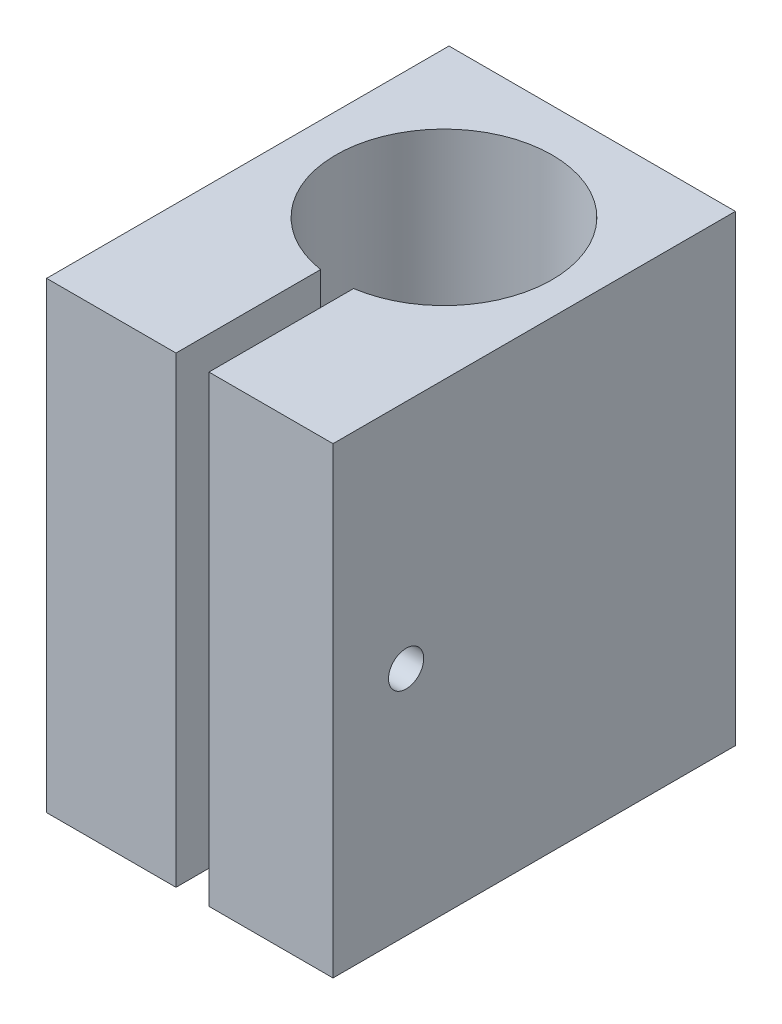
ISO-10303-21;
HEADER;
FILE_DESCRIPTION(('STEP AP214'),'2;1');
FILE_NAME('part.step','',(''),(''),'','','');
FILE_SCHEMA(('AUTOMOTIVE_DESIGN { 1 0 10303 214 1 1 1 1 }'));
ENDSEC;
DATA;
#1=APPLICATION_CONTEXT('core data for automotive mechanical design processes');
#2=APPLICATION_PROTOCOL_DEFINITION('international standard','automotive_design',2000,#1);
#3=PRODUCT_CONTEXT('',#1,'mechanical');
#4=PRODUCT('Part','Part','',(#3));
#5=PRODUCT_RELATED_PRODUCT_CATEGORY('part','',(#4));
#6=PRODUCT_DEFINITION_FORMATION('','',#4);
#7=PRODUCT_DEFINITION_CONTEXT('part definition',#1,'design');
#8=PRODUCT_DEFINITION('design','',#6,#7);
#9=PRODUCT_DEFINITION_SHAPE('','',#8);
#10=(LENGTH_UNIT() NAMED_UNIT(*) SI_UNIT(.MILLI.,.METRE.));
#11=(NAMED_UNIT(*) PLANE_ANGLE_UNIT() SI_UNIT($,.RADIAN.));
#12=(NAMED_UNIT(*) SI_UNIT($,.STERADIAN.) SOLID_ANGLE_UNIT());
#13=UNCERTAINTY_MEASURE_WITH_UNIT(LENGTH_MEASURE(1.E-05),#10,'distance_accuracy_value','');
#14=(GEOMETRIC_REPRESENTATION_CONTEXT(3) GLOBAL_UNCERTAINTY_ASSIGNED_CONTEXT((#13)) GLOBAL_UNIT_ASSIGNED_CONTEXT((#10,
#11,#12)) REPRESENTATION_CONTEXT('',''));
#15=CARTESIAN_POINT('',(0.,0.,0.));
#16=DIRECTION('',(0.,0.,1.));
#17=DIRECTION('',(1.,0.,0.));
#18=AXIS2_PLACEMENT_3D('',#15,#16,#17);
#19=CARTESIAN_POINT('',(1.90309523809524,46.,20.));
#20=DIRECTION('',(0.,0.,-1.));
#21=DIRECTION('',(-1.,0.,0.));
#22=AXIS2_PLACEMENT_3D('',#19,#20,#21);
#23=PLANE('',#22);
#24=DIRECTION('',(1.,0.,0.));
#25=VECTOR('',#24,1.);
#26=CARTESIAN_POINT('',(1.90309523809524,0.,20.));
#27=LINE('',#26,#25);
#28=CARTESIAN_POINT('',(1.90309523809524,0.,20.));
#29=VERTEX_POINT('',#28);
#30=CARTESIAN_POINT('',(14.235,0.,20.));
#31=VERTEX_POINT('',#30);
#32=EDGE_CURVE('E148',#29,#31,#27,.T.);
#33=ORIENTED_EDGE('',*,*,#32,.T.);
#34=DIRECTION('',(0.,-1.,0.));
#35=VECTOR('',#34,1.);
#36=CARTESIAN_POINT('',(14.235,46.,20.));
#37=LINE('',#36,#35);
#38=CARTESIAN_POINT('',(14.235,46.,20.));
#39=VERTEX_POINT('',#38);
#40=EDGE_CURVE('E11',#39,#31,#37,.T.);
#41=ORIENTED_EDGE('',*,*,#40,.F.);
#42=DIRECTION('',(1.,0.,0.));
#43=VECTOR('',#42,1.);
#44=CARTESIAN_POINT('',(1.90309523809524,46.,20.));
#45=LINE('',#44,#43);
#46=CARTESIAN_POINT('',(1.90309523809524,46.,20.));
#47=VERTEX_POINT('',#46);
#48=EDGE_CURVE('E164',#47,#39,#45,.T.);
#49=ORIENTED_EDGE('',*,*,#48,.F.);
#50=DIRECTION('',(0.,-1.,0.));
#51=VECTOR('',#50,1.);
#52=CARTESIAN_POINT('',(1.90309523809524,46.,20.));
#53=LINE('',#52,#51);
#54=EDGE_CURVE('E144',#47,#29,#53,.T.);
#55=ORIENTED_EDGE('',*,*,#54,.T.);
#56=EDGE_LOOP('',(#33,#41,#49,#55));
#57=FACE_BOUND('',#56,.T.);
#58=ADVANCED_FACE('F39',(#57),#23,.F.);
#59=CARTESIAN_POINT('',(14.235,46.,-20.));
#60=DIRECTION('',(-1.,0.,0.));
#61=DIRECTION('',(0.,0.,1.));
#62=AXIS2_PLACEMENT_3D('',#59,#60,#61);
#63=PLANE('',#62);
#64=CARTESIAN_POINT('',(14.235,23.,12.7330134340511));
#65=DIRECTION('',(-1.,0.,0.));
#66=DIRECTION('',(0.,0.,1.));
#67=AXIS2_PLACEMENT_3D('',#64,#65,#66);
#68=CIRCLE('',#67,1.75);
#69=CARTESIAN_POINT('',(14.235,23.,14.4830134340511));
#70=VERTEX_POINT('',#69);
#71=EDGE_CURVE('E253',#70,#70,#68,.T.);
#72=ORIENTED_EDGE('',*,*,#71,.T.);
#73=EDGE_LOOP('',(#72));
#74=FACE_BOUND('',#73,.T.);
#75=DIRECTION('',(0.,0.,-1.));
#76=VECTOR('',#75,1.);
#77=CARTESIAN_POINT('',(14.235,0.,-20.));
#78=LINE('',#77,#76);
#79=CARTESIAN_POINT('',(14.235,0.,-20.));
#80=VERTEX_POINT('',#79);
#81=EDGE_CURVE('E151',#31,#80,#78,.T.);
#82=ORIENTED_EDGE('',*,*,#81,.T.);
#83=DIRECTION('',(0.,-1.,0.));
#84=VECTOR('',#83,1.);
#85=CARTESIAN_POINT('',(14.235,46.,-20.));
#86=LINE('',#85,#84);
#87=CARTESIAN_POINT('',(14.235,46.,-20.));
#88=VERTEX_POINT('',#87);
#89=EDGE_CURVE('E47',#88,#80,#86,.T.);
#90=ORIENTED_EDGE('',*,*,#89,.F.);
#91=DIRECTION('',(0.,0.,-1.));
#92=VECTOR('',#91,1.);
#93=CARTESIAN_POINT('',(14.235,46.,-20.));
#94=LINE('',#93,#92);
#95=EDGE_CURVE('E104',#39,#88,#94,.T.);
#96=ORIENTED_EDGE('',*,*,#95,.F.);
#97=ORIENTED_EDGE('',*,*,#40,.T.);
#98=EDGE_LOOP('',(#82,#90,#96,#97));
#99=FACE_BOUND('',#98,.T.);
#100=ADVANCED_FACE('F277',(#74,#99),#63,.F.);
#101=CARTESIAN_POINT('',(-14.235,46.,-20.));
#102=DIRECTION('',(0.,0.,1.));
#103=DIRECTION('',(1.,0.,0.));
#104=AXIS2_PLACEMENT_3D('',#101,#102,#103);
#105=PLANE('',#104);
#106=DIRECTION('',(-1.,0.,0.));
#107=VECTOR('',#106,1.);
#108=CARTESIAN_POINT('',(-14.235,0.,-20.));
#109=LINE('',#108,#107);
#110=CARTESIAN_POINT('',(-14.235,0.,-20.));
#111=VERTEX_POINT('',#110);
#112=EDGE_CURVE('E154',#80,#111,#109,.T.);
#113=ORIENTED_EDGE('',*,*,#112,.T.);
#114=DIRECTION('',(0.,-1.,0.));
#115=VECTOR('',#114,1.);
#116=CARTESIAN_POINT('',(-14.235,46.,-20.));
#117=LINE('',#116,#115);
#118=CARTESIAN_POINT('',(-14.235,46.,-20.));
#119=VERTEX_POINT('',#118);
#120=EDGE_CURVE('E171',#119,#111,#117,.T.);
#121=ORIENTED_EDGE('',*,*,#120,.F.);
#122=DIRECTION('',(-1.,0.,0.));
#123=VECTOR('',#122,1.);
#124=CARTESIAN_POINT('',(-14.235,46.,-20.));
#125=LINE('',#124,#123);
#126=EDGE_CURVE('E180',#88,#119,#125,.T.);
#127=ORIENTED_EDGE('',*,*,#126,.F.);
#128=ORIENTED_EDGE('',*,*,#89,.T.);
#129=EDGE_LOOP('',(#113,#121,#127,#128));
#130=FACE_BOUND('',#129,.T.);
#131=ADVANCED_FACE('F178',(#130),#105,.F.);
#132=CARTESIAN_POINT('',(-14.235,46.,-20.));
#133=DIRECTION('',(1.,0.,0.));
#134=DIRECTION('',(0.,0.,-1.));
#135=AXIS2_PLACEMENT_3D('',#132,#133,#134);
#136=PLANE('',#135);
#137=DIRECTION('',(0.,0.5,0.866025403784438));
#138=VECTOR('',#137,1.);
#139=CARTESIAN_POINT('',(-14.235,19.75,12.7330134340511));
#140=LINE('',#139,#138);
#141=CARTESIAN_POINT('',(-14.235,19.75,12.7330134340511));
#142=VERTEX_POINT('',#141);
#143=CARTESIAN_POINT('',(-14.235,21.375,15.5475959963505));
#144=VERTEX_POINT('',#143);
#145=EDGE_CURVE('E227',#142,#144,#140,.T.);
#146=ORIENTED_EDGE('',*,*,#145,.F.);
#147=DIRECTION('',(0.,-0.500000000000001,0.866025403784438));
#148=VECTOR('',#147,1.);
#149=CARTESIAN_POINT('',(-14.235,21.375,9.91843087175167));
#150=LINE('',#149,#148);
#151=CARTESIAN_POINT('',(-14.235,21.375,9.91843087175167));
#152=VERTEX_POINT('',#151);
#153=EDGE_CURVE('E54',#152,#142,#150,.T.);
#154=ORIENTED_EDGE('',*,*,#153,.F.);
#155=DIRECTION('',(0.,-1.,0.));
#156=VECTOR('',#155,1.);
#157=CARTESIAN_POINT('',(-14.235,24.625,9.91843087175167));
#158=LINE('',#157,#156);
#159=CARTESIAN_POINT('',(-14.235,24.625,9.91843087175167));
#160=VERTEX_POINT('',#159);
#161=EDGE_CURVE('E214',#160,#152,#158,.T.);
#162=ORIENTED_EDGE('',*,*,#161,.F.);
#163=DIRECTION('',(0.,-0.5,-0.866025403784439));
#164=VECTOR('',#163,1.);
#165=CARTESIAN_POINT('',(-14.235,26.25,12.7330134340511));
#166=LINE('',#165,#164);
#167=CARTESIAN_POINT('',(-14.235,26.25,12.7330134340511));
#168=VERTEX_POINT('',#167);
#169=EDGE_CURVE('E218',#168,#160,#166,.T.);
#170=ORIENTED_EDGE('',*,*,#169,.F.);
#171=DIRECTION('',(0.,0.5,-0.866025403784438));
#172=VECTOR('',#171,1.);
#173=CARTESIAN_POINT('',(-14.235,24.625,15.5475959963505));
#174=LINE('',#173,#172);
#175=CARTESIAN_POINT('',(-14.235,24.625,15.5475959963505));
#176=VERTEX_POINT('',#175);
#177=EDGE_CURVE('E221',#176,#168,#174,.T.);
#178=ORIENTED_EDGE('',*,*,#177,.F.);
#179=DIRECTION('',(0.,1.,0.));
#180=VECTOR('',#179,1.);
#181=CARTESIAN_POINT('',(-14.235,21.375,15.5475959963505));
#182=LINE('',#181,#180);
#183=EDGE_CURVE('E224',#144,#176,#182,.T.);
#184=ORIENTED_EDGE('',*,*,#183,.F.);
#185=EDGE_LOOP('',(#146,#154,#162,#170,#178,#184));
#186=FACE_BOUND('',#185,.T.);
#187=DIRECTION('',(0.,0.,1.));
#188=VECTOR('',#187,1.);
#189=CARTESIAN_POINT('',(-14.235,0.,-20.));
#190=LINE('',#189,#188);
#191=CARTESIAN_POINT('',(-14.235,0.,20.));
#192=VERTEX_POINT('',#191);
#193=EDGE_CURVE('E156',#111,#192,#190,.T.);
#194=ORIENTED_EDGE('',*,*,#193,.T.);
#195=DIRECTION('',(0.,-1.,0.));
#196=VECTOR('',#195,1.);
#197=CARTESIAN_POINT('',(-14.235,46.,20.));
#198=LINE('',#197,#196);
#199=CARTESIAN_POINT('',(-14.235,46.,20.));
#200=VERTEX_POINT('',#199);
#201=EDGE_CURVE('E168',#200,#192,#198,.T.);
#202=ORIENTED_EDGE('',*,*,#201,.F.);
#203=DIRECTION('',(0.,0.,1.));
#204=VECTOR('',#203,1.);
#205=CARTESIAN_POINT('',(-14.235,46.,-20.));
#206=LINE('',#205,#204);
#207=EDGE_CURVE('E192',#119,#200,#206,.T.);
#208=ORIENTED_EDGE('',*,*,#207,.F.);
#209=ORIENTED_EDGE('',*,*,#120,.T.);
#210=EDGE_LOOP('',(#194,#202,#208,#209));
#211=FACE_BOUND('',#210,.T.);
#212=ADVANCED_FACE('F188',(#186,#211),#136,.F.);
#213=CARTESIAN_POINT('',(-14.235,46.,20.));
#214=DIRECTION('',(0.,0.,-1.));
#215=DIRECTION('',(-1.,0.,0.));
#216=AXIS2_PLACEMENT_3D('',#213,#214,#215);
#217=PLANE('',#216);
#218=DIRECTION('',(1.,0.,0.));
#219=VECTOR('',#218,1.);
#220=CARTESIAN_POINT('',(-14.235,0.,20.));
#221=LINE('',#220,#219);
#222=CARTESIAN_POINT('',(-1.37309523809524,0.,20.));
#223=VERTEX_POINT('',#222);
#224=EDGE_CURVE('E158',#192,#223,#221,.T.);
#225=ORIENTED_EDGE('',*,*,#224,.T.);
#226=DIRECTION('',(0.,-1.,0.));
#227=VECTOR('',#226,1.);
#228=CARTESIAN_POINT('',(-1.37309523809524,46.,20.));
#229=LINE('',#228,#227);
#230=CARTESIAN_POINT('',(-1.37309523809524,46.,20.));
#231=VERTEX_POINT('',#230);
#232=EDGE_CURVE('E139',#231,#223,#229,.T.);
#233=ORIENTED_EDGE('',*,*,#232,.F.);
#234=DIRECTION('',(1.,0.,0.));
#235=VECTOR('',#234,1.);
#236=CARTESIAN_POINT('',(-14.235,46.,20.));
#237=LINE('',#236,#235);
#238=EDGE_CURVE('E127',#200,#231,#237,.T.);
#239=ORIENTED_EDGE('',*,*,#238,.F.);
#240=ORIENTED_EDGE('',*,*,#201,.T.);
#241=EDGE_LOOP('',(#225,#233,#239,#240));
#242=FACE_BOUND('',#241,.T.);
#243=ADVANCED_FACE('F191',(#242),#217,.F.);
#244=CARTESIAN_POINT('',(-1.37309523809524,46.,20.));
#245=DIRECTION('',(-1.,0.,0.));
#246=DIRECTION('',(0.,0.,1.));
#247=AXIS2_PLACEMENT_3D('',#244,#245,#246);
#248=PLANE('',#247);
#249=CARTESIAN_POINT('',(-1.37309523809524,23.,12.7330134340511));
#250=DIRECTION('',(-1.,0.,0.));
#251=DIRECTION('',(0.,0.,1.));
#252=AXIS2_PLACEMENT_3D('',#249,#250,#251);
#253=CIRCLE('',#252,1.75);
#254=CARTESIAN_POINT('',(-1.37309523809524,23.,14.4830134340511));
#255=VERTEX_POINT('',#254);
#256=EDGE_CURVE('E231',#255,#255,#253,.T.);
#257=ORIENTED_EDGE('',*,*,#256,.T.);
#258=EDGE_LOOP('',(#257));
#259=FACE_BOUND('',#258,.T.);
#260=DIRECTION('',(0.,0.,-1.));
#261=VECTOR('',#260,1.);
#262=CARTESIAN_POINT('',(-1.37309523809524,0.,20.));
#263=LINE('',#262,#261);
#264=CARTESIAN_POINT('',(-1.37309523809524,0.,5.62445970348278));
#265=VERTEX_POINT('',#264);
#266=EDGE_CURVE('E136',#223,#265,#263,.T.);
#267=ORIENTED_EDGE('',*,*,#266,.T.);
#268=DIRECTION('',(0.,-1.,0.));
#269=VECTOR('',#268,1.);
#270=CARTESIAN_POINT('',(-1.37309523809524,46.,5.62445970348278));
#271=LINE('',#270,#269);
#272=CARTESIAN_POINT('',(-1.37309523809524,46.,5.62445970348278));
#273=VERTEX_POINT('',#272);
#274=EDGE_CURVE('E133',#273,#265,#271,.T.);
#275=ORIENTED_EDGE('',*,*,#274,.F.);
#276=DIRECTION('',(0.,0.,-1.));
#277=VECTOR('',#276,1.);
#278=CARTESIAN_POINT('',(-1.37309523809524,46.,20.));
#279=LINE('',#278,#277);
#280=EDGE_CURVE('E120',#231,#273,#279,.T.);
#281=ORIENTED_EDGE('',*,*,#280,.F.);
#282=ORIENTED_EDGE('',*,*,#232,.T.);
#283=EDGE_LOOP('',(#267,#275,#281,#282));
#284=FACE_BOUND('',#283,.T.);
#285=ADVANCED_FACE('F134',(#259,#284),#248,.F.);
#286=CARTESIAN_POINT('',(0.264999999999999,46.,-5.00000000000001));
#287=DIRECTION('',(0.,-1.,0.));
#288=DIRECTION('',(0.,0.,-1.));
#289=AXIS2_PLACEMENT_3D('',#286,#287,#288);
#290=CYLINDRICAL_SURFACE('',#289,10.75);
#291=CARTESIAN_POINT('',(0.264999999999999,0.,-5.00000000000001));
#292=DIRECTION('',(0.,-1.,0.));
#293=DIRECTION('',(0.,0.,1.));
#294=AXIS2_PLACEMENT_3D('',#291,#292,#293);
#295=CIRCLE('',#294,10.75);
#296=CARTESIAN_POINT('',(1.90309523809524,0.,5.62445970348278));
#297=VERTEX_POINT('',#296);
#298=EDGE_CURVE('E161',#265,#297,#295,.T.);
#299=ORIENTED_EDGE('',*,*,#298,.T.);
#300=DIRECTION('',(0.,-1.,0.));
#301=VECTOR('',#300,1.);
#302=CARTESIAN_POINT('',(1.90309523809524,46.,5.62445970348278));
#303=LINE('',#302,#301);
#304=CARTESIAN_POINT('',(1.90309523809524,46.,5.62445970348278));
#305=VERTEX_POINT('',#304);
#306=EDGE_CURVE('E140',#305,#297,#303,.T.);
#307=ORIENTED_EDGE('',*,*,#306,.F.);
#308=CARTESIAN_POINT('',(0.264999999999999,46.,-5.00000000000001));
#309=DIRECTION('',(0.,-1.,0.));
#310=DIRECTION('',(0.,0.,1.));
#311=AXIS2_PLACEMENT_3D('',#308,#309,#310);
#312=CIRCLE('',#311,10.75);
#313=EDGE_CURVE('E124',#273,#305,#312,.T.);
#314=ORIENTED_EDGE('',*,*,#313,.F.);
#315=ORIENTED_EDGE('',*,*,#274,.T.);
#316=EDGE_LOOP('',(#299,#307,#314,#315));
#317=FACE_BOUND('',#316,.T.);
#318=ADVANCED_FACE('F142',(#317),#290,.F.);
#319=CARTESIAN_POINT('',(1.90309523809524,46.,20.));
#320=DIRECTION('',(1.,0.,0.));
#321=DIRECTION('',(0.,0.,-1.));
#322=AXIS2_PLACEMENT_3D('',#319,#320,#321);
#323=PLANE('',#322);
#324=CARTESIAN_POINT('',(1.90309523809524,23.,12.7330134340511));
#325=DIRECTION('',(1.,0.,0.));
#326=DIRECTION('',(0.,0.,-1.));
#327=AXIS2_PLACEMENT_3D('',#324,#325,#326);
#328=CIRCLE('',#327,1.75);
#329=CARTESIAN_POINT('',(1.90309523809524,23.,10.9830134340511));
#330=VERTEX_POINT('',#329);
#331=EDGE_CURVE('E42',#330,#330,#328,.T.);
#332=ORIENTED_EDGE('',*,*,#331,.T.);
#333=EDGE_LOOP('',(#332));
#334=FACE_BOUND('',#333,.T.);
#335=DIRECTION('',(0.,0.,1.));
#336=VECTOR('',#335,1.);
#337=CARTESIAN_POINT('',(1.90309523809524,0.,20.));
#338=LINE('',#337,#336);
#339=EDGE_CURVE('E96',#297,#29,#338,.T.);
#340=ORIENTED_EDGE('',*,*,#339,.T.);
#341=ORIENTED_EDGE('',*,*,#54,.F.);
#342=DIRECTION('',(0.,0.,1.));
#343=VECTOR('',#342,1.);
#344=CARTESIAN_POINT('',(1.90309523809524,46.,20.));
#345=LINE('',#344,#343);
#346=EDGE_CURVE('E63',#305,#47,#345,.T.);
#347=ORIENTED_EDGE('',*,*,#346,.F.);
#348=ORIENTED_EDGE('',*,*,#306,.T.);
#349=EDGE_LOOP('',(#340,#341,#347,#348));
#350=FACE_BOUND('',#349,.T.);
#351=ADVANCED_FACE('F260',(#334,#350),#323,.F.);
#352=CARTESIAN_POINT('',(0.264999999999999,46.,-5.00000000000001));
#353=DIRECTION('',(0.,1.,0.));
#354=DIRECTION('',(0.,0.,1.));
#355=AXIS2_PLACEMENT_3D('',#352,#353,#354);
#356=PLANE('',#355);
#357=ORIENTED_EDGE('',*,*,#48,.T.);
#358=ORIENTED_EDGE('',*,*,#95,.T.);
#359=ORIENTED_EDGE('',*,*,#126,.T.);
#360=ORIENTED_EDGE('',*,*,#207,.T.);
#361=ORIENTED_EDGE('',*,*,#238,.T.);
#362=ORIENTED_EDGE('',*,*,#280,.T.);
#363=ORIENTED_EDGE('',*,*,#313,.T.);
#364=ORIENTED_EDGE('',*,*,#346,.T.);
#365=EDGE_LOOP('',(#357,#358,#359,#360,#361,#362,#363,#364));
#366=FACE_BOUND('',#365,.T.);
#367=ADVANCED_FACE('F122',(#366),#356,.T.);
#368=CARTESIAN_POINT('',(0.264999999999999,0.,-5.00000000000001));
#369=DIRECTION('',(0.,1.,0.));
#370=DIRECTION('',(0.,0.,1.));
#371=AXIS2_PLACEMENT_3D('',#368,#369,#370);
#372=PLANE('',#371);
#373=ORIENTED_EDGE('',*,*,#32,.F.);
#374=ORIENTED_EDGE('',*,*,#339,.F.);
#375=ORIENTED_EDGE('',*,*,#298,.F.);
#376=ORIENTED_EDGE('',*,*,#266,.F.);
#377=ORIENTED_EDGE('',*,*,#224,.F.);
#378=ORIENTED_EDGE('',*,*,#193,.F.);
#379=ORIENTED_EDGE('',*,*,#112,.F.);
#380=ORIENTED_EDGE('',*,*,#81,.F.);
#381=EDGE_LOOP('',(#373,#374,#375,#376,#377,#378,#379,#380));
#382=FACE_BOUND('',#381,.T.);
#383=ADVANCED_FACE('F184',(#382),#372,.F.);
#384=CARTESIAN_POINT('',(-11.235,21.375,9.91843087175167));
#385=DIRECTION('',(0.,-0.866025403784438,-0.500000000000001));
#386=DIRECTION('',(0.,0.500000000000001,-0.866025403784438));
#387=AXIS2_PLACEMENT_3D('',#384,#385,#386);
#388=PLANE('',#387);
#389=ORIENTED_EDGE('',*,*,#153,.T.);
#390=DIRECTION('',(-1.,0.,0.));
#391=VECTOR('',#390,1.);
#392=CARTESIAN_POINT('',(-11.235,19.75,12.7330134340511));
#393=LINE('',#392,#391);
#394=CARTESIAN_POINT('',(-11.235,19.75,12.7330134340511));
#395=VERTEX_POINT('',#394);
#396=EDGE_CURVE('E198',#395,#142,#393,.T.);
#397=ORIENTED_EDGE('',*,*,#396,.F.);
#398=DIRECTION('',(0.,-0.500000000000001,0.866025403784438));
#399=VECTOR('',#398,1.);
#400=CARTESIAN_POINT('',(-11.235,21.375,9.91843087175167));
#401=LINE('',#400,#399);
#402=CARTESIAN_POINT('',(-11.235,21.375,9.91843087175167));
#403=VERTEX_POINT('',#402);
#404=EDGE_CURVE('E217',#403,#395,#401,.T.);
#405=ORIENTED_EDGE('',*,*,#404,.F.);
#406=DIRECTION('',(-1.,0.,0.));
#407=VECTOR('',#406,1.);
#408=CARTESIAN_POINT('',(-11.235,21.375,9.91843087175167));
#409=LINE('',#408,#407);
#410=EDGE_CURVE('E152',#403,#152,#409,.T.);
#411=ORIENTED_EDGE('',*,*,#410,.T.);
#412=EDGE_LOOP('',(#389,#397,#405,#411));
#413=FACE_BOUND('',#412,.T.);
#414=ADVANCED_FACE('F339',(#413),#388,.F.);
#415=CARTESIAN_POINT('',(-11.235,24.625,9.91843087175167));
#416=DIRECTION('',(0.,0.,-1.));
#417=DIRECTION('',(-1.,0.,0.));
#418=AXIS2_PLACEMENT_3D('',#415,#416,#417);
#419=PLANE('',#418);
#420=ORIENTED_EDGE('',*,*,#161,.T.);
#421=ORIENTED_EDGE('',*,*,#410,.F.);
#422=DIRECTION('',(0.,-1.,0.));
#423=VECTOR('',#422,1.);
#424=CARTESIAN_POINT('',(-11.235,24.625,9.91843087175167));
#425=LINE('',#424,#423);
#426=CARTESIAN_POINT('',(-11.235,24.625,9.91843087175167));
#427=VERTEX_POINT('',#426);
#428=EDGE_CURVE('E201',#427,#403,#425,.T.);
#429=ORIENTED_EDGE('',*,*,#428,.F.);
#430=DIRECTION('',(-1.,0.,0.));
#431=VECTOR('',#430,1.);
#432=CARTESIAN_POINT('',(-11.235,24.625,9.91843087175167));
#433=LINE('',#432,#431);
#434=EDGE_CURVE('E210',#427,#160,#433,.T.);
#435=ORIENTED_EDGE('',*,*,#434,.T.);
#436=EDGE_LOOP('',(#420,#421,#429,#435));
#437=FACE_BOUND('',#436,.T.);
#438=ADVANCED_FACE('F347',(#437),#419,.F.);
#439=CARTESIAN_POINT('',(-11.235,26.25,12.7330134340511));
#440=DIRECTION('',(0.,0.866025403784439,-0.5));
#441=DIRECTION('',(0.,0.5,0.866025403784439));
#442=AXIS2_PLACEMENT_3D('',#439,#440,#441);
#443=PLANE('',#442);
#444=ORIENTED_EDGE('',*,*,#169,.T.);
#445=ORIENTED_EDGE('',*,*,#434,.F.);
#446=DIRECTION('',(0.,-0.5,-0.866025403784439));
#447=VECTOR('',#446,1.);
#448=CARTESIAN_POINT('',(-11.235,26.25,12.7330134340511));
#449=LINE('',#448,#447);
#450=CARTESIAN_POINT('',(-11.235,26.25,12.7330134340511));
#451=VERTEX_POINT('',#450);
#452=EDGE_CURVE('E234',#451,#427,#449,.T.);
#453=ORIENTED_EDGE('',*,*,#452,.F.);
#454=DIRECTION('',(-1.,0.,0.));
#455=VECTOR('',#454,1.);
#456=CARTESIAN_POINT('',(-11.235,26.25,12.7330134340511));
#457=LINE('',#456,#455);
#458=EDGE_CURVE('E207',#451,#168,#457,.T.);
#459=ORIENTED_EDGE('',*,*,#458,.T.);
#460=EDGE_LOOP('',(#444,#445,#453,#459));
#461=FACE_BOUND('',#460,.T.);
#462=ADVANCED_FACE('F353',(#461),#443,.F.);
#463=CARTESIAN_POINT('',(-11.235,24.625,15.5475959963505));
#464=DIRECTION('',(0.,0.866025403784438,0.5));
#465=DIRECTION('',(0.,-0.5,0.866025403784438));
#466=AXIS2_PLACEMENT_3D('',#463,#464,#465);
#467=PLANE('',#466);
#468=ORIENTED_EDGE('',*,*,#177,.T.);
#469=ORIENTED_EDGE('',*,*,#458,.F.);
#470=DIRECTION('',(0.,0.5,-0.866025403784438));
#471=VECTOR('',#470,1.);
#472=CARTESIAN_POINT('',(-11.235,24.625,15.5475959963505));
#473=LINE('',#472,#471);
#474=CARTESIAN_POINT('',(-11.235,24.625,15.5475959963505));
#475=VERTEX_POINT('',#474);
#476=EDGE_CURVE('E237',#475,#451,#473,.T.);
#477=ORIENTED_EDGE('',*,*,#476,.F.);
#478=DIRECTION('',(-1.,0.,0.));
#479=VECTOR('',#478,1.);
#480=CARTESIAN_POINT('',(-11.235,24.625,15.5475959963505));
#481=LINE('',#480,#479);
#482=EDGE_CURVE('E204',#475,#176,#481,.T.);
#483=ORIENTED_EDGE('',*,*,#482,.T.);
#484=EDGE_LOOP('',(#468,#469,#477,#483));
#485=FACE_BOUND('',#484,.T.);
#486=ADVANCED_FACE('F361',(#485),#467,.F.);
#487=CARTESIAN_POINT('',(-11.235,21.375,15.5475959963505));
#488=DIRECTION('',(0.,0.,1.));
#489=DIRECTION('',(1.,0.,0.));
#490=AXIS2_PLACEMENT_3D('',#487,#488,#489);
#491=PLANE('',#490);
#492=ORIENTED_EDGE('',*,*,#183,.T.);
#493=ORIENTED_EDGE('',*,*,#482,.F.);
#494=DIRECTION('',(0.,1.,0.));
#495=VECTOR('',#494,1.);
#496=CARTESIAN_POINT('',(-11.235,21.375,15.5475959963505));
#497=LINE('',#496,#495);
#498=CARTESIAN_POINT('',(-11.235,21.375,15.5475959963505));
#499=VERTEX_POINT('',#498);
#500=EDGE_CURVE('E240',#499,#475,#497,.T.);
#501=ORIENTED_EDGE('',*,*,#500,.F.);
#502=DIRECTION('',(-1.,0.,0.));
#503=VECTOR('',#502,1.);
#504=CARTESIAN_POINT('',(-11.235,21.375,15.5475959963505));
#505=LINE('',#504,#503);
#506=EDGE_CURVE('E200',#499,#144,#505,.T.);
#507=ORIENTED_EDGE('',*,*,#506,.T.);
#508=EDGE_LOOP('',(#492,#493,#501,#507));
#509=FACE_BOUND('',#508,.T.);
#510=ADVANCED_FACE('F369',(#509),#491,.F.);
#511=CARTESIAN_POINT('',(-11.235,19.75,12.7330134340511));
#512=DIRECTION('',(0.,-0.866025403784438,0.5));
#513=DIRECTION('',(0.,-0.5,-0.866025403784438));
#514=AXIS2_PLACEMENT_3D('',#511,#512,#513);
#515=PLANE('',#514);
#516=ORIENTED_EDGE('',*,*,#145,.T.);
#517=ORIENTED_EDGE('',*,*,#506,.F.);
#518=DIRECTION('',(0.,0.5,0.866025403784438));
#519=VECTOR('',#518,1.);
#520=CARTESIAN_POINT('',(-11.235,19.75,12.7330134340511));
#521=LINE('',#520,#519);
#522=EDGE_CURVE('E243',#395,#499,#521,.T.);
#523=ORIENTED_EDGE('',*,*,#522,.F.);
#524=ORIENTED_EDGE('',*,*,#396,.T.);
#525=EDGE_LOOP('',(#516,#517,#523,#524));
#526=FACE_BOUND('',#525,.T.);
#527=ADVANCED_FACE('F273',(#526),#515,.F.);
#528=CARTESIAN_POINT('',(-11.235,0.,0.));
#529=DIRECTION('',(-1.,0.,0.));
#530=DIRECTION('',(0.,-1.,0.));
#531=AXIS2_PLACEMENT_3D('',#528,#529,#530);
#532=PLANE('',#531);
#533=CARTESIAN_POINT('',(-11.235,23.,12.7330134340511));
#534=DIRECTION('',(-1.,0.,0.));
#535=DIRECTION('',(0.,0.,1.));
#536=AXIS2_PLACEMENT_3D('',#533,#534,#535);
#537=CIRCLE('',#536,1.75);
#538=CARTESIAN_POINT('',(-11.235,23.,14.4830134340511));
#539=VERTEX_POINT('',#538);
#540=EDGE_CURVE('E250',#539,#539,#537,.T.);
#541=ORIENTED_EDGE('',*,*,#540,.F.);
#542=EDGE_LOOP('',(#541));
#543=FACE_BOUND('',#542,.T.);
#544=ORIENTED_EDGE('',*,*,#404,.T.);
#545=ORIENTED_EDGE('',*,*,#522,.T.);
#546=ORIENTED_EDGE('',*,*,#500,.T.);
#547=ORIENTED_EDGE('',*,*,#476,.T.);
#548=ORIENTED_EDGE('',*,*,#452,.T.);
#549=ORIENTED_EDGE('',*,*,#428,.T.);
#550=EDGE_LOOP('',(#544,#545,#546,#547,#548,#549));
#551=FACE_BOUND('',#550,.T.);
#552=ADVANCED_FACE('F265',(#543,#551),#532,.T.);
#553=CARTESIAN_POINT('',(14.235,23.,12.7330134340511));
#554=DIRECTION('',(-1.,0.,0.));
#555=DIRECTION('',(0.,0.,1.));
#556=AXIS2_PLACEMENT_3D('',#553,#554,#555);
#557=CYLINDRICAL_SURFACE('',#556,1.75);
#558=ORIENTED_EDGE('',*,*,#71,.F.);
#559=EDGE_LOOP('',(#558));
#560=FACE_BOUND('',#559,.T.);
#561=ORIENTED_EDGE('',*,*,#331,.F.);
#562=EDGE_LOOP('',(#561));
#563=FACE_BOUND('',#562,.T.);
#564=ADVANCED_FACE('F262',(#560,#563),#557,.F.);
#565=ORIENTED_EDGE('',*,*,#540,.T.);
#566=EDGE_LOOP('',(#565));
#567=FACE_BOUND('',#566,.T.);
#568=ORIENTED_EDGE('',*,*,#256,.F.);
#569=EDGE_LOOP('',(#568));
#570=FACE_BOUND('',#569,.T.);
#571=ADVANCED_FACE('F264',(#567,#570),#557,.F.);
#572=CLOSED_SHELL('',(#58,#100,#131,#212,#243,#285,#318,#351,#367,#383,#414,#438,#462,#486,#510,
#527,#552,#564,#571));
#573=MANIFOLD_SOLID_BREP('B2',#572);
#574=ADVANCED_BREP_SHAPE_REPRESENTATION('',(#18,#573),#14);
#575=SHAPE_DEFINITION_REPRESENTATION(#9,#574);
ENDSEC;
END-ISO-10303-21;
